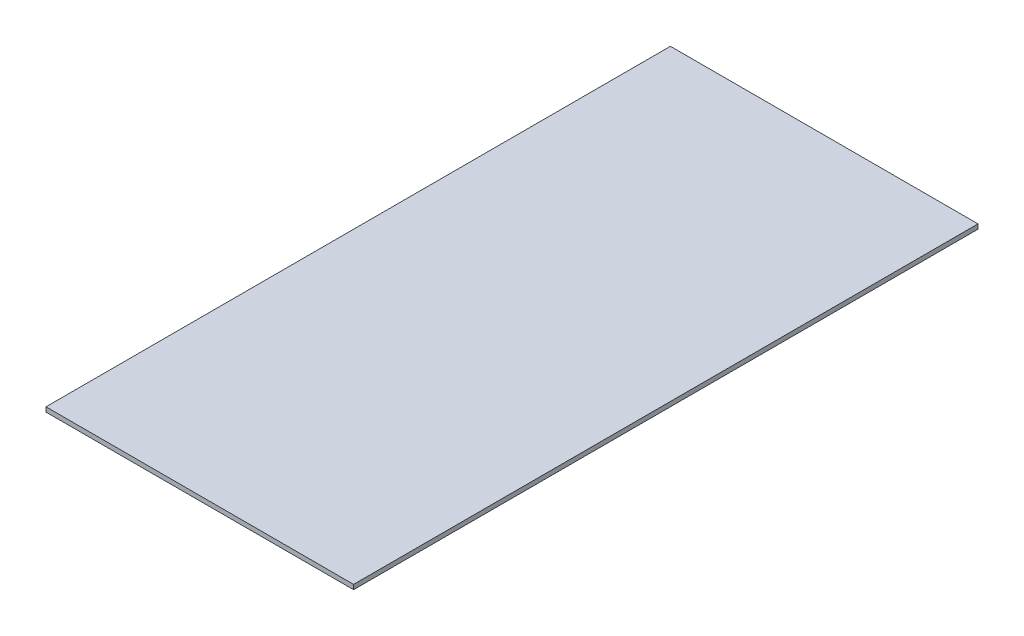
ISO-10303-21;
HEADER;
FILE_DESCRIPTION(('STEP AP214'),'2;1');
FILE_NAME('part.step','',(''),(''),'','','');
FILE_SCHEMA(('AUTOMOTIVE_DESIGN { 1 0 10303 214 1 1 1 1 }'));
ENDSEC;
DATA;
#1=APPLICATION_CONTEXT('core data for automotive mechanical design processes');
#2=APPLICATION_PROTOCOL_DEFINITION('international standard','automotive_design',2000,#1);
#3=PRODUCT_CONTEXT('',#1,'mechanical');
#4=PRODUCT('Part','Part','',(#3));
#5=PRODUCT_RELATED_PRODUCT_CATEGORY('part','',(#4));
#6=PRODUCT_DEFINITION_FORMATION('','',#4);
#7=PRODUCT_DEFINITION_CONTEXT('part definition',#1,'design');
#8=PRODUCT_DEFINITION('design','',#6,#7);
#9=PRODUCT_DEFINITION_SHAPE('','',#8);
#10=(LENGTH_UNIT() NAMED_UNIT(*) SI_UNIT(.MILLI.,.METRE.));
#11=(NAMED_UNIT(*) PLANE_ANGLE_UNIT() SI_UNIT($,.RADIAN.));
#12=(NAMED_UNIT(*) SI_UNIT($,.STERADIAN.) SOLID_ANGLE_UNIT());
#13=UNCERTAINTY_MEASURE_WITH_UNIT(LENGTH_MEASURE(1.E-05),#10,'distance_accuracy_value','');
#14=(GEOMETRIC_REPRESENTATION_CONTEXT(3) GLOBAL_UNCERTAINTY_ASSIGNED_CONTEXT((#13)) GLOBAL_UNIT_ASSIGNED_CONTEXT((#10,
#11,#12)) REPRESENTATION_CONTEXT('',''));
#15=CARTESIAN_POINT('',(0.,0.,0.));
#16=DIRECTION('',(0.,0.,1.));
#17=DIRECTION('',(1.,0.,0.));
#18=AXIS2_PLACEMENT_3D('',#15,#16,#17);
#19=CARTESIAN_POINT('',(100.,3.,203.));
#20=DIRECTION('',(-1.,0.,0.));
#21=DIRECTION('',(0.,0.,1.));
#22=AXIS2_PLACEMENT_3D('',#19,#20,#21);
#23=PLANE('',#22);
#24=DIRECTION('',(0.,0.,-1.));
#25=VECTOR('',#24,1.);
#26=CARTESIAN_POINT('',(100.,0.,203.));
#27=LINE('',#26,#25);
#28=CARTESIAN_POINT('',(100.,0.,203.));
#29=VERTEX_POINT('',#28);
#30=CARTESIAN_POINT('',(100.,0.,-203.));
#31=VERTEX_POINT('',#30);
#32=EDGE_CURVE('E96',#29,#31,#27,.T.);
#33=ORIENTED_EDGE('',*,*,#32,.T.);
#34=DIRECTION('',(0.,-1.,0.));
#35=VECTOR('',#34,1.);
#36=CARTESIAN_POINT('',(100.,3.,-203.));
#37=LINE('',#36,#35);
#38=CARTESIAN_POINT('',(100.,3.,-203.));
#39=VERTEX_POINT('',#38);
#40=EDGE_CURVE('E11',#39,#31,#37,.T.);
#41=ORIENTED_EDGE('',*,*,#40,.F.);
#42=DIRECTION('',(0.,0.,-1.));
#43=VECTOR('',#42,1.);
#44=CARTESIAN_POINT('',(100.,3.,203.));
#45=LINE('',#44,#43);
#46=CARTESIAN_POINT('',(100.,3.,203.));
#47=VERTEX_POINT('',#46);
#48=EDGE_CURVE('E84',#47,#39,#45,.T.);
#49=ORIENTED_EDGE('',*,*,#48,.F.);
#50=DIRECTION('',(0.,-1.,0.));
#51=VECTOR('',#50,1.);
#52=CARTESIAN_POINT('',(100.,3.,203.));
#53=LINE('',#52,#51);
#54=EDGE_CURVE('E92',#47,#29,#53,.T.);
#55=ORIENTED_EDGE('',*,*,#54,.T.);
#56=EDGE_LOOP('',(#33,#41,#49,#55));
#57=FACE_BOUND('',#56,.T.);
#58=ADVANCED_FACE('F33',(#57),#23,.F.);
#59=CARTESIAN_POINT('',(-99.9999999999999,3.,-203.));
#60=DIRECTION('',(0.,0.,1.));
#61=DIRECTION('',(1.,0.,0.));
#62=AXIS2_PLACEMENT_3D('',#59,#60,#61);
#63=PLANE('',#62);
#64=DIRECTION('',(-1.,0.,0.));
#65=VECTOR('',#64,1.);
#66=CARTESIAN_POINT('',(-99.9999999999999,0.,-203.));
#67=LINE('',#66,#65);
#68=CARTESIAN_POINT('',(-99.9999999999999,0.,-203.));
#69=VERTEX_POINT('',#68);
#70=EDGE_CURVE('E88',#31,#69,#67,.T.);
#71=ORIENTED_EDGE('',*,*,#70,.T.);
#72=DIRECTION('',(0.,-1.,0.));
#73=VECTOR('',#72,1.);
#74=CARTESIAN_POINT('',(-99.9999999999999,3.,-203.));
#75=LINE('',#74,#73);
#76=CARTESIAN_POINT('',(-99.9999999999999,3.,-203.));
#77=VERTEX_POINT('',#76);
#78=EDGE_CURVE('E41',#77,#69,#75,.T.);
#79=ORIENTED_EDGE('',*,*,#78,.F.);
#80=DIRECTION('',(-1.,0.,0.));
#81=VECTOR('',#80,1.);
#82=CARTESIAN_POINT('',(-99.9999999999999,3.,-203.));
#83=LINE('',#82,#81);
#84=EDGE_CURVE('E79',#39,#77,#83,.T.);
#85=ORIENTED_EDGE('',*,*,#84,.F.);
#86=ORIENTED_EDGE('',*,*,#40,.T.);
#87=EDGE_LOOP('',(#71,#79,#85,#86));
#88=FACE_BOUND('',#87,.T.);
#89=ADVANCED_FACE('F87',(#88),#63,.F.);
#90=CARTESIAN_POINT('',(-99.9999999999999,3.,203.));
#91=DIRECTION('',(1.,0.,0.));
#92=DIRECTION('',(0.,0.,-1.));
#93=AXIS2_PLACEMENT_3D('',#90,#91,#92);
#94=PLANE('',#93);
#95=DIRECTION('',(0.,0.,1.));
#96=VECTOR('',#95,1.);
#97=CARTESIAN_POINT('',(-99.9999999999999,0.,203.));
#98=LINE('',#97,#96);
#99=CARTESIAN_POINT('',(-99.9999999999999,0.,203.));
#100=VERTEX_POINT('',#99);
#101=EDGE_CURVE('E66',#69,#100,#98,.T.);
#102=ORIENTED_EDGE('',*,*,#101,.T.);
#103=DIRECTION('',(0.,-1.,0.));
#104=VECTOR('',#103,1.);
#105=CARTESIAN_POINT('',(-99.9999999999999,3.,203.));
#106=LINE('',#105,#104);
#107=CARTESIAN_POINT('',(-99.9999999999999,3.,203.));
#108=VERTEX_POINT('',#107);
#109=EDGE_CURVE('E89',#108,#100,#106,.T.);
#110=ORIENTED_EDGE('',*,*,#109,.F.);
#111=DIRECTION('',(0.,0.,1.));
#112=VECTOR('',#111,1.);
#113=CARTESIAN_POINT('',(-99.9999999999999,3.,203.));
#114=LINE('',#113,#112);
#115=EDGE_CURVE('E82',#77,#108,#114,.T.);
#116=ORIENTED_EDGE('',*,*,#115,.F.);
#117=ORIENTED_EDGE('',*,*,#78,.T.);
#118=EDGE_LOOP('',(#102,#110,#116,#117));
#119=FACE_BOUND('',#118,.T.);
#120=ADVANCED_FACE('F90',(#119),#94,.F.);
#121=CARTESIAN_POINT('',(-99.9999999999999,3.,203.));
#122=DIRECTION('',(0.,0.,-1.));
#123=DIRECTION('',(-1.,0.,0.));
#124=AXIS2_PLACEMENT_3D('',#121,#122,#123);
#125=PLANE('',#124);
#126=DIRECTION('',(1.,0.,0.));
#127=VECTOR('',#126,1.);
#128=CARTESIAN_POINT('',(-99.9999999999999,0.,203.));
#129=LINE('',#128,#127);
#130=EDGE_CURVE('E72',#100,#29,#129,.T.);
#131=ORIENTED_EDGE('',*,*,#130,.T.);
#132=ORIENTED_EDGE('',*,*,#54,.F.);
#133=DIRECTION('',(1.,0.,0.));
#134=VECTOR('',#133,1.);
#135=CARTESIAN_POINT('',(-99.9999999999999,3.,203.));
#136=LINE('',#135,#134);
#137=EDGE_CURVE('E49',#108,#47,#136,.T.);
#138=ORIENTED_EDGE('',*,*,#137,.F.);
#139=ORIENTED_EDGE('',*,*,#109,.T.);
#140=EDGE_LOOP('',(#131,#132,#138,#139));
#141=FACE_BOUND('',#140,.T.);
#142=ADVANCED_FACE('F103',(#141),#125,.F.);
#143=CARTESIAN_POINT('',(0.,3.,0.));
#144=DIRECTION('',(0.,-1.,0.));
#145=DIRECTION('',(0.,0.,-1.));
#146=AXIS2_PLACEMENT_3D('',#143,#144,#145);
#147=PLANE('',#146);
#148=ORIENTED_EDGE('',*,*,#48,.T.);
#149=ORIENTED_EDGE('',*,*,#84,.T.);
#150=ORIENTED_EDGE('',*,*,#115,.T.);
#151=ORIENTED_EDGE('',*,*,#137,.T.);
#152=EDGE_LOOP('',(#148,#149,#150,#151));
#153=FACE_BOUND('',#152,.T.);
#154=ADVANCED_FACE('F80',(#153),#147,.F.);
#155=CARTESIAN_POINT('',(0.,0.,0.));
#156=DIRECTION('',(0.,-1.,0.));
#157=DIRECTION('',(0.,0.,-1.));
#158=AXIS2_PLACEMENT_3D('',#155,#156,#157);
#159=PLANE('',#158);
#160=ORIENTED_EDGE('',*,*,#32,.F.);
#161=ORIENTED_EDGE('',*,*,#130,.F.);
#162=ORIENTED_EDGE('',*,*,#101,.F.);
#163=ORIENTED_EDGE('',*,*,#70,.F.);
#164=EDGE_LOOP('',(#160,#161,#162,#163));
#165=FACE_BOUND('',#164,.T.);
#166=ADVANCED_FACE('F106',(#165),#159,.T.);
#167=CLOSED_SHELL('',(#58,#89,#120,#142,#154,#166));
#168=MANIFOLD_SOLID_BREP('B2',#167);
#169=ADVANCED_BREP_SHAPE_REPRESENTATION('',(#18,#168),#14);
#170=SHAPE_DEFINITION_REPRESENTATION(#9,#169);
ENDSEC;
END-ISO-10303-21;
